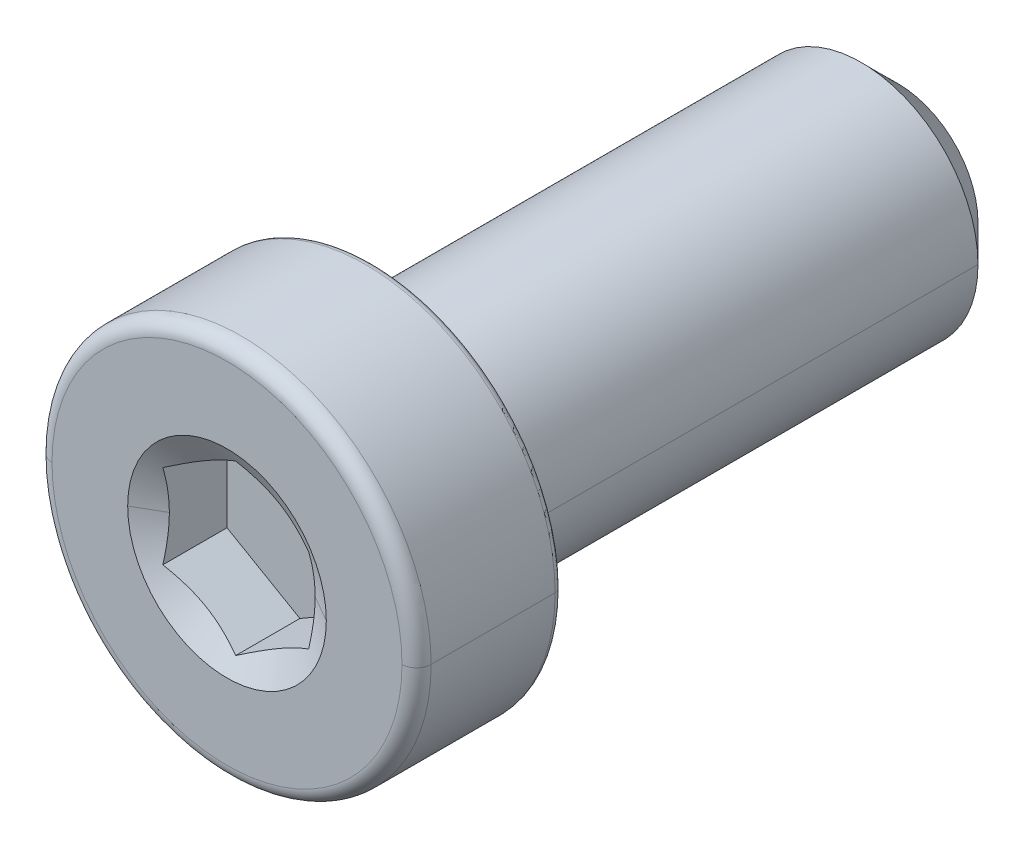
ISO-10303-21;
HEADER;
FILE_DESCRIPTION(('STEP AP214'),'2;1');
FILE_NAME('part.step','',(''),(''),'','','');
FILE_SCHEMA(('AUTOMOTIVE_DESIGN { 1 0 10303 214 1 1 1 1 }'));
ENDSEC;
DATA;
#1=APPLICATION_CONTEXT('core data for automotive mechanical design processes');
#2=APPLICATION_PROTOCOL_DEFINITION('international standard','automotive_design',2000,#1);
#3=PRODUCT_CONTEXT('',#1,'mechanical');
#4=PRODUCT('Part','Part','',(#3));
#5=PRODUCT_RELATED_PRODUCT_CATEGORY('part','',(#4));
#6=PRODUCT_DEFINITION_FORMATION('','',#4);
#7=PRODUCT_DEFINITION_CONTEXT('part definition',#1,'design');
#8=PRODUCT_DEFINITION('design','',#6,#7);
#9=PRODUCT_DEFINITION_SHAPE('','',#8);
#10=(LENGTH_UNIT() NAMED_UNIT(*) SI_UNIT(.MILLI.,.METRE.));
#11=(NAMED_UNIT(*) PLANE_ANGLE_UNIT() SI_UNIT($,.RADIAN.));
#12=(NAMED_UNIT(*) SI_UNIT($,.STERADIAN.) SOLID_ANGLE_UNIT());
#13=UNCERTAINTY_MEASURE_WITH_UNIT(LENGTH_MEASURE(1.E-05),#10,'distance_accuracy_value','');
#14=(GEOMETRIC_REPRESENTATION_CONTEXT(3) GLOBAL_UNCERTAINTY_ASSIGNED_CONTEXT((#13)) GLOBAL_UNIT_ASSIGNED_CONTEXT((#10,
#11,#12)) REPRESENTATION_CONTEXT('',''));
#15=CARTESIAN_POINT('',(0.,0.,0.));
#16=DIRECTION('',(0.,0.,1.));
#17=DIRECTION('',(1.,0.,0.));
#18=AXIS2_PLACEMENT_3D('',#15,#16,#17);
#19=CARTESIAN_POINT('',(0.,2.88675134594812,9.));
#20=DIRECTION('',(-0.5,0.866025403784439,0.));
#21=DIRECTION('',(0.,0.,1.));
#22=AXIS2_PLACEMENT_3D('',#19,#20,#21);
#23=PLANE('',#22);
#24=DIRECTION('',(0.,0.,1.));
#25=VECTOR('',#24,1.);
#26=CARTESIAN_POINT('',(0.,2.88675134594812,9.));
#27=LINE('',#26,#25);
#28=CARTESIAN_POINT('',(0.,2.88675134594812,9.));
#29=VERTEX_POINT('',#28);
#30=CARTESIAN_POINT('',(0.,2.88675134594812,11.2004275085881));
#31=VERTEX_POINT('',#30);
#32=EDGE_CURVE('E11',#29,#31,#27,.T.);
#33=ORIENTED_EDGE('',*,*,#32,.T.);
#34=CARTESIAN_POINT('',(0.,2.88675134594812,11.2004275085881));
#35=CARTESIAN_POINT('',(-0.668337161455183,2.50088670587255,10.9776484547674));
#36=CARTESIAN_POINT('',(-1.24761370688667,2.16644123643244,10.9771373916047));
#37=CARTESIAN_POINT('',(-1.55740642705021,1.98758232605303,10.9768640788863));
#38=CARTESIAN_POINT('',(-1.88103545904448,1.80073501731356,11.0371948002052));
#39=CARTESIAN_POINT('',(-2.17432824928568,1.63140234591643,11.0918702583488));
#40=CARTESIAN_POINT('',(-2.5,1.44337567297406,11.2004275085881));
#41=B_SPLINE_CURVE_WITH_KNOTS('',2,(#34,#35,#36,#37,#38,#39,#40),.UNSPECIFIED.,.F.,.F.,(3,2,2,
3),(0.,0.5,0.75,1.),.UNSPECIFIED.);
#42=CARTESIAN_POINT('',(-2.5,1.44337567297406,11.2004275085882));
#43=VERTEX_POINT('',#42);
#44=EDGE_CURVE('E180',#31,#43,#41,.T.);
#45=ORIENTED_EDGE('',*,*,#44,.T.);
#46=DIRECTION('',(0.,0.,1.));
#47=VECTOR('',#46,1.);
#48=CARTESIAN_POINT('',(-2.5,1.44337567297406,9.));
#49=LINE('',#48,#47);
#50=CARTESIAN_POINT('',(-2.5,1.44337567297406,9.));
#51=VERTEX_POINT('',#50);
#52=EDGE_CURVE('E174',#51,#43,#49,.T.);
#53=ORIENTED_EDGE('',*,*,#52,.F.);
#54=DIRECTION('',(-0.866025403784439,-0.5,0.));
#55=VECTOR('',#54,1.);
#56=CARTESIAN_POINT('',(0.,2.88675134594812,9.));
#57=LINE('',#56,#55);
#58=EDGE_CURVE('E419',#29,#51,#57,.T.);
#59=ORIENTED_EDGE('',*,*,#58,.F.);
#60=EDGE_LOOP('',(#33,#45,#53,#59));
#61=FACE_BOUND('',#60,.T.);
#62=ADVANCED_FACE('F16',(#61),#23,.F.);
#63=CARTESIAN_POINT('',(2.5,1.44337567297406,9.));
#64=DIRECTION('',(0.5,0.866025403784439,0.));
#65=DIRECTION('',(0.,0.,-1.));
#66=AXIS2_PLACEMENT_3D('',#63,#64,#65);
#67=PLANE('',#66);
#68=DIRECTION('',(0.,0.,1.));
#69=VECTOR('',#68,1.);
#70=CARTESIAN_POINT('',(2.5,1.44337567297406,9.));
#71=LINE('',#70,#69);
#72=CARTESIAN_POINT('',(2.5,1.44337567297406,9.));
#73=VERTEX_POINT('',#72);
#74=CARTESIAN_POINT('',(2.5,1.44337567297406,11.2004275085881));
#75=VERTEX_POINT('',#74);
#76=EDGE_CURVE('E28',#73,#75,#71,.T.);
#77=ORIENTED_EDGE('',*,*,#76,.T.);
#78=CARTESIAN_POINT('',(2.5,1.44337567297406,11.2004275085881));
#79=CARTESIAN_POINT('',(1.83166283853831,1.8292403130534,10.9776484547652));
#80=CARTESIAN_POINT('',(1.25238629311333,2.16368578248975,10.9771373916047));
#81=CARTESIAN_POINT('',(0.942593572943423,2.34254469287283,10.9768640788875));
#82=CARTESIAN_POINT('',(0.618964540955522,2.52939200160862,11.0371948002052));
#83=CARTESIAN_POINT('',(0.325671750714267,2.69872467300579,11.0918702583489));
#84=CARTESIAN_POINT('',(0.,2.88675134594812,11.2004275085881));
#85=B_SPLINE_CURVE_WITH_KNOTS('',2,(#78,#79,#80,#81,#82,#83,#84),.UNSPECIFIED.,.F.,.F.,(3,2,2,
3),(0.,0.5,0.75,1.),.UNSPECIFIED.);
#86=EDGE_CURVE('E406',#75,#31,#85,.T.);
#87=ORIENTED_EDGE('',*,*,#86,.T.);
#88=ORIENTED_EDGE('',*,*,#32,.F.);
#89=DIRECTION('',(-0.866025403784439,0.5,0.));
#90=VECTOR('',#89,1.);
#91=CARTESIAN_POINT('',(2.5,1.44337567297406,9.));
#92=LINE('',#91,#90);
#93=EDGE_CURVE('E272',#73,#29,#92,.T.);
#94=ORIENTED_EDGE('',*,*,#93,.F.);
#95=EDGE_LOOP('',(#77,#87,#88,#94));
#96=FACE_BOUND('',#95,.T.);
#97=ADVANCED_FACE('F312',(#96),#67,.F.);
#98=CARTESIAN_POINT('',(2.5,-1.44337567297406,9.));
#99=DIRECTION('',(1.,0.,0.));
#100=DIRECTION('',(0.,1.,0.));
#101=AXIS2_PLACEMENT_3D('',#98,#99,#100);
#102=PLANE('',#101);
#103=DIRECTION('',(0.,0.,1.));
#104=VECTOR('',#103,1.);
#105=CARTESIAN_POINT('',(2.5,-1.44337567297406,9.));
#106=LINE('',#105,#104);
#107=CARTESIAN_POINT('',(2.5,-1.44337567297406,9.));
#108=VERTEX_POINT('',#107);
#109=CARTESIAN_POINT('',(2.5,-1.44337567297406,11.2004275085881));
#110=VERTEX_POINT('',#109);
#111=EDGE_CURVE('E52',#108,#110,#106,.T.);
#112=ORIENTED_EDGE('',*,*,#111,.T.);
#113=CARTESIAN_POINT('',(2.5,-1.44337567297406,11.2004275085881));
#114=CARTESIAN_POINT('',(2.5,-1.06712601980721,11.0918135893189));
#115=CARTESIAN_POINT('',(2.5,-0.72721411045275,11.0369619110228));
#116=CARTESIAN_POINT('',(2.5,-0.356480429056918,10.9771365148955));
#117=CARTESIAN_POINT('',(2.5,0.,10.9771365148955));
#118=B_SPLINE_CURVE_WITH_KNOTS('',2,(#113,#114,#115,#116,#117),.UNSPECIFIED.,.F.,.F.,(3,2,3),
(0.,0.5,1.),.UNSPECIFIED.);
#119=CARTESIAN_POINT('',(2.5,0.,10.9771365148955));
#120=VERTEX_POINT('',#119);
#121=EDGE_CURVE('E329',#110,#120,#118,.T.);
#122=ORIENTED_EDGE('',*,*,#121,.T.);
#123=CARTESIAN_POINT('',(2.5,0.,10.9771365148955));
#124=CARTESIAN_POINT('',(2.5,0.358406770652268,10.9771365148955));
#125=CARTESIAN_POINT('',(2.5,0.732414374404408,11.0378032632905));
#126=CARTESIAN_POINT('',(2.5,1.06935846545522,11.0924580408669));
#127=CARTESIAN_POINT('',(2.5,1.44337567297406,11.2004275085881));
#128=B_SPLINE_CURVE_WITH_KNOTS('',2,(#123,#124,#125,#126,#127),.UNSPECIFIED.,.F.,.F.,(3,2,3),
(0.,0.5,1.),.UNSPECIFIED.);
#129=EDGE_CURVE('E298',#120,#75,#128,.T.);
#130=ORIENTED_EDGE('',*,*,#129,.T.);
#131=ORIENTED_EDGE('',*,*,#76,.F.);
#132=DIRECTION('',(0.,1.,0.));
#133=VECTOR('',#132,1.);
#134=CARTESIAN_POINT('',(2.5,-1.44337567297406,9.));
#135=LINE('',#134,#133);
#136=EDGE_CURVE('E281',#108,#73,#135,.T.);
#137=ORIENTED_EDGE('',*,*,#136,.F.);
#138=EDGE_LOOP('',(#112,#122,#130,#131,#137));
#139=FACE_BOUND('',#138,.T.);
#140=ADVANCED_FACE('F303',(#139),#102,.F.);
#141=CARTESIAN_POINT('',(0.,-2.88675134594812,9.));
#142=DIRECTION('',(0.5,-0.866025403784439,0.));
#143=DIRECTION('',(0.,0.,-1.));
#144=AXIS2_PLACEMENT_3D('',#141,#142,#143);
#145=PLANE('',#144);
#146=DIRECTION('',(0.,0.,1.));
#147=VECTOR('',#146,1.);
#148=CARTESIAN_POINT('',(0.,-2.88675134594812,9.));
#149=LINE('',#148,#147);
#150=CARTESIAN_POINT('',(0.,-2.88675134594812,9.));
#151=VERTEX_POINT('',#150);
#152=CARTESIAN_POINT('',(0.,-2.88675134594812,11.2004275085881));
#153=VERTEX_POINT('',#152);
#154=EDGE_CURVE('E278',#151,#153,#149,.T.);
#155=ORIENTED_EDGE('',*,*,#154,.T.);
#156=CARTESIAN_POINT('',(0.,-2.88675134594812,11.2004275085881));
#157=CARTESIAN_POINT('',(0.668337161451883,-2.50088670587445,10.9776484547685));
#158=CARTESIAN_POINT('',(1.24761370688667,-2.16644123643244,10.9771373916047));
#159=CARTESIAN_POINT('',(1.55740642704725,-1.98758232605474,10.9768640788857));
#160=CARTESIAN_POINT('',(1.88103545904447,-1.80073501731356,11.0371948002052));
#161=CARTESIAN_POINT('',(2.17432824928573,-1.6314023459164,11.0918702583489));
#162=CARTESIAN_POINT('',(2.49999999999999,-1.44337567297406,11.2004275085881));
#163=B_SPLINE_CURVE_WITH_KNOTS('',2,(#156,#157,#158,#159,#160,#161,#162),.UNSPECIFIED.,.F.,.F.,
(3,2,2,3),(0.,0.5,0.75,1.),.UNSPECIFIED.);
#164=EDGE_CURVE('E375',#153,#110,#163,.T.);
#165=ORIENTED_EDGE('',*,*,#164,.T.);
#166=ORIENTED_EDGE('',*,*,#111,.F.);
#167=DIRECTION('',(0.866025403784438,0.5,0.));
#168=VECTOR('',#167,1.);
#169=CARTESIAN_POINT('',(0.,-2.88675134594812,9.));
#170=LINE('',#169,#168);
#171=EDGE_CURVE('E291',#151,#108,#170,.T.);
#172=ORIENTED_EDGE('',*,*,#171,.F.);
#173=EDGE_LOOP('',(#155,#165,#166,#172));
#174=FACE_BOUND('',#173,.T.);
#175=ADVANCED_FACE('F311',(#174),#145,.F.);
#176=CARTESIAN_POINT('',(-2.5,-1.44337567297407,9.));
#177=DIRECTION('',(-0.5,-0.866025403784439,0.));
#178=DIRECTION('',(-0.866025403784439,0.5,0.));
#179=AXIS2_PLACEMENT_3D('',#176,#177,#178);
#180=PLANE('',#179);
#181=DIRECTION('',(0.,0.,1.));
#182=VECTOR('',#181,1.);
#183=CARTESIAN_POINT('',(-2.5,-1.44337567297407,9.));
#184=LINE('',#183,#182);
#185=CARTESIAN_POINT('',(-2.5,-1.44337567297407,9.));
#186=VERTEX_POINT('',#185);
#187=CARTESIAN_POINT('',(-2.5,-1.44337567297407,11.2004275085881));
#188=VERTEX_POINT('',#187);
#189=EDGE_CURVE('E271',#186,#188,#184,.T.);
#190=ORIENTED_EDGE('',*,*,#189,.T.);
#191=CARTESIAN_POINT('',(-2.5,-1.44337567297407,11.2004275085881));
#192=CARTESIAN_POINT('',(-1.83166283854483,-1.82924031304964,10.9776484547674));
#193=CARTESIAN_POINT('',(-1.25238629311333,-2.16368578248975,10.9771373916047));
#194=CARTESIAN_POINT('',(-0.942593572952958,-2.34254469286733,10.9768640788863));
#195=CARTESIAN_POINT('',(-0.618964540955527,-2.52939200160862,11.0371948002052));
#196=CARTESIAN_POINT('',(-0.325671750718056,-2.6987246730036,11.0918702583476));
#197=CARTESIAN_POINT('',(0.,-2.88675134594813,11.2004275085881));
#198=B_SPLINE_CURVE_WITH_KNOTS('',2,(#191,#192,#193,#194,#195,#196,#197),.UNSPECIFIED.,.F.,.F.,
(3,2,2,3),(0.,0.5,0.75,1.),.UNSPECIFIED.);
#199=EDGE_CURVE('E198',#188,#153,#198,.T.);
#200=ORIENTED_EDGE('',*,*,#199,.T.);
#201=ORIENTED_EDGE('',*,*,#154,.F.);
#202=DIRECTION('',(0.866025403784439,-0.5,0.));
#203=VECTOR('',#202,1.);
#204=CARTESIAN_POINT('',(-2.5,-1.44337567297407,9.));
#205=LINE('',#204,#203);
#206=EDGE_CURVE('E440',#186,#151,#205,.T.);
#207=ORIENTED_EDGE('',*,*,#206,.F.);
#208=EDGE_LOOP('',(#190,#200,#201,#207));
#209=FACE_BOUND('',#208,.T.);
#210=ADVANCED_FACE('F216',(#209),#180,.F.);
#211=CARTESIAN_POINT('',(-2.5,1.44337567297406,9.));
#212=DIRECTION('',(-1.,0.,0.));
#213=DIRECTION('',(0.,1.,0.));
#214=AXIS2_PLACEMENT_3D('',#211,#212,#213);
#215=PLANE('',#214);
#216=ORIENTED_EDGE('',*,*,#52,.T.);
#217=CARTESIAN_POINT('',(-2.5,1.44337567297406,11.2004275085881));
#218=CARTESIAN_POINT('',(-2.5,1.06995270684028,11.0926295835787));
#219=CARTESIAN_POINT('',(-2.5,0.732414374404409,11.0378032632905));
#220=CARTESIAN_POINT('',(-2.5,0.358919436573382,10.9771365148955));
#221=CARTESIAN_POINT('',(-2.5,0.,10.9771365148955));
#222=B_SPLINE_CURVE_WITH_KNOTS('',2,(#217,#218,#219,#220,#221),.UNSPECIFIED.,.F.,.F.,(3,2,3),
(0.,0.5,1.),.UNSPECIFIED.);
#223=CARTESIAN_POINT('',(-2.5,0.,10.9771365148955));
#224=VERTEX_POINT('',#223);
#225=EDGE_CURVE('E166',#43,#224,#222,.T.);
#226=ORIENTED_EDGE('',*,*,#225,.T.);
#227=CARTESIAN_POINT('',(-2.5,0.,10.9771365148955));
#228=CARTESIAN_POINT('',(-2.5,-0.355967710710843,10.9771365148955));
#229=CARTESIAN_POINT('',(-2.5,-0.727214110452753,11.0369619110228));
#230=CARTESIAN_POINT('',(-2.5,-1.0665319986419,11.0916421101791));
#231=CARTESIAN_POINT('',(-2.5,-1.44337567297407,11.2004275085881));
#232=B_SPLINE_CURVE_WITH_KNOTS('',2,(#227,#228,#229,#230,#231),.UNSPECIFIED.,.F.,.F.,(3,2,3),
(0.,0.5,1.),.UNSPECIFIED.);
#233=EDGE_CURVE('E171',#224,#188,#232,.T.);
#234=ORIENTED_EDGE('',*,*,#233,.T.);
#235=ORIENTED_EDGE('',*,*,#189,.F.);
#236=DIRECTION('',(0.,-1.,0.));
#237=VECTOR('',#236,1.);
#238=CARTESIAN_POINT('',(-2.5,1.44337567297406,9.));
#239=LINE('',#238,#237);
#240=EDGE_CURVE('E444',#51,#186,#239,.T.);
#241=ORIENTED_EDGE('',*,*,#240,.F.);
#242=EDGE_LOOP('',(#216,#226,#234,#235,#241));
#243=FACE_BOUND('',#242,.T.);
#244=ADVANCED_FACE('F169',(#243),#215,.F.);
#245=CARTESIAN_POINT('',(0.,0.,9.));
#246=DIRECTION('',(0.,0.,1.));
#247=DIRECTION('',(1.,0.,0.));
#248=AXIS2_PLACEMENT_3D('',#245,#246,#247);
#249=PLANE('',#248);
#250=ORIENTED_EDGE('',*,*,#58,.T.);
#251=ORIENTED_EDGE('',*,*,#240,.T.);
#252=ORIENTED_EDGE('',*,*,#206,.T.);
#253=ORIENTED_EDGE('',*,*,#171,.T.);
#254=ORIENTED_EDGE('',*,*,#136,.T.);
#255=ORIENTED_EDGE('',*,*,#93,.T.);
#256=EDGE_LOOP('',(#250,#251,#252,#253,#254,#255));
#257=FACE_BOUND('',#256,.T.);
#258=ADVANCED_FACE('F215',(#257),#249,.T.);
#259=CARTESIAN_POINT('',(0.,0.,11.5));
#260=DIRECTION('',(0.,0.,1.));
#261=DIRECTION('',(1.,0.,0.));
#262=AXIS2_PLACEMENT_3D('',#259,#260,#261);
#263=CONICAL_SURFACE('',#262,3.40562612162344,1.0471975511966);
#264=DIRECTION('',(-0.86602540378444,0.,0.5));
#265=VECTOR('',#264,1.);
#266=CARTESIAN_POINT('',(-3.40562612162344,0.,11.5));
#267=LINE('',#266,#265);
#268=CARTESIAN_POINT('',(-3.40562612162344,0.,11.5));
#269=VERTEX_POINT('',#268);
#270=EDGE_CURVE('E185',#224,#269,#267,.T.);
#271=ORIENTED_EDGE('',*,*,#270,.F.);
#272=ORIENTED_EDGE('',*,*,#225,.F.);
#273=ORIENTED_EDGE('',*,*,#44,.F.);
#274=ORIENTED_EDGE('',*,*,#86,.F.);
#275=ORIENTED_EDGE('',*,*,#129,.F.);
#276=DIRECTION('',(0.86602540378444,0.,0.5));
#277=VECTOR('',#276,1.);
#278=CARTESIAN_POINT('',(3.40562612162344,0.,11.5));
#279=LINE('',#278,#277);
#280=CARTESIAN_POINT('',(3.40562612162344,0.,11.5));
#281=VERTEX_POINT('',#280);
#282=EDGE_CURVE('E390',#120,#281,#279,.T.);
#283=ORIENTED_EDGE('',*,*,#282,.T.);
#284=CARTESIAN_POINT('',(0.,0.,11.5));
#285=DIRECTION('',(0.,0.,1.));
#286=DIRECTION('',(1.,0.,0.));
#287=AXIS2_PLACEMENT_3D('',#284,#285,#286);
#288=CIRCLE('',#287,3.40562612162344);
#289=EDGE_CURVE('E181',#281,#269,#288,.T.);
#290=ORIENTED_EDGE('',*,*,#289,.T.);
#291=EDGE_LOOP('',(#271,#272,#273,#274,#275,#283,#290));
#292=FACE_BOUND('',#291,.T.);
#293=ADVANCED_FACE('F186',(#292),#263,.F.);
#294=CARTESIAN_POINT('',(0.,6.,11.5));
#295=DIRECTION('',(0.,0.,1.));
#296=DIRECTION('',(1.,0.,0.));
#297=AXIS2_PLACEMENT_3D('',#294,#295,#296);
#298=PLANE('',#297);
#299=ORIENTED_EDGE('',*,*,#289,.F.);
#300=CARTESIAN_POINT('',(0.,0.,11.5));
#301=DIRECTION('',(0.,0.,1.));
#302=DIRECTION('',(1.,0.,0.));
#303=AXIS2_PLACEMENT_3D('',#300,#301,#302);
#304=CIRCLE('',#303,3.40562612162344);
#305=EDGE_CURVE('E192',#269,#281,#304,.T.);
#306=ORIENTED_EDGE('',*,*,#305,.F.);
#307=EDGE_LOOP('',(#299,#306));
#308=FACE_BOUND('',#307,.T.);
#309=CARTESIAN_POINT('',(0.,0.,11.5));
#310=DIRECTION('',(0.,0.,-1.));
#311=DIRECTION('',(-1.,0.,0.));
#312=AXIS2_PLACEMENT_3D('',#309,#310,#311);
#313=CIRCLE('',#312,6.);
#314=CARTESIAN_POINT('',(-6.,0.,11.5));
#315=VERTEX_POINT('',#314);
#316=CARTESIAN_POINT('',(6.,0.,11.5));
#317=VERTEX_POINT('',#316);
#318=EDGE_CURVE('E389',#315,#317,#313,.T.);
#319=ORIENTED_EDGE('',*,*,#318,.F.);
#320=CARTESIAN_POINT('',(0.,0.,11.5));
#321=DIRECTION('',(0.,0.,-1.));
#322=DIRECTION('',(-1.,0.,0.));
#323=AXIS2_PLACEMENT_3D('',#320,#321,#322);
#324=CIRCLE('',#323,6.);
#325=EDGE_CURVE('E454',#317,#315,#324,.T.);
#326=ORIENTED_EDGE('',*,*,#325,.F.);
#327=EDGE_LOOP('',(#319,#326));
#328=FACE_BOUND('',#327,.T.);
#329=ADVANCED_FACE('F217',(#308,#328),#298,.T.);
#330=CARTESIAN_POINT('',(0.,0.,11.));
#331=DIRECTION('',(0.,0.,-1.));
#332=DIRECTION('',(-1.,0.,0.));
#333=AXIS2_PLACEMENT_3D('',#330,#331,#332);
#334=TOROIDAL_SURFACE('',#333,6.,0.5);
#335=CARTESIAN_POINT('',(6.,0.,11.));
#336=DIRECTION('',(0.,1.,0.));
#337=DIRECTION('',(-1.,0.,0.));
#338=AXIS2_PLACEMENT_3D('',#335,#336,#337);
#339=CIRCLE('',#338,0.5);
#340=CARTESIAN_POINT('',(6.5,0.,11.));
#341=VERTEX_POINT('',#340);
#342=EDGE_CURVE('E522',#317,#341,#339,.T.);
#343=ORIENTED_EDGE('',*,*,#342,.F.);
#344=ORIENTED_EDGE('',*,*,#325,.T.);
#345=CARTESIAN_POINT('',(-6.,0.,11.));
#346=DIRECTION('',(0.,-1.,0.));
#347=DIRECTION('',(0.,0.,-1.));
#348=AXIS2_PLACEMENT_3D('',#345,#346,#347);
#349=CIRCLE('',#348,0.5);
#350=CARTESIAN_POINT('',(-6.5,0.,11.));
#351=VERTEX_POINT('',#350);
#352=EDGE_CURVE('E513',#315,#351,#349,.T.);
#353=ORIENTED_EDGE('',*,*,#352,.T.);
#354=CARTESIAN_POINT('',(0.,0.,11.));
#355=DIRECTION('',(0.,0.,-1.));
#356=DIRECTION('',(-1.,0.,0.));
#357=AXIS2_PLACEMENT_3D('',#354,#355,#356);
#358=CIRCLE('',#357,6.5);
#359=EDGE_CURVE('E457',#341,#351,#358,.T.);
#360=ORIENTED_EDGE('',*,*,#359,.F.);
#361=EDGE_LOOP('',(#343,#344,#353,#360));
#362=FACE_BOUND('',#361,.T.);
#363=ADVANCED_FACE('F245',(#362),#334,.T.);
#364=CARTESIAN_POINT('',(0.,0.,-11.5));
#365=DIRECTION('',(0.,0.,-1.));
#366=DIRECTION('',(-1.,0.,0.));
#367=AXIS2_PLACEMENT_3D('',#364,#365,#366);
#368=CYLINDRICAL_SURFACE('',#367,6.5);
#369=DIRECTION('',(0.,0.,-1.));
#370=VECTOR('',#369,1.);
#371=CARTESIAN_POINT('',(6.5,0.,-11.5));
#372=LINE('',#371,#370);
#373=CARTESIAN_POINT('',(6.5,0.,6.75));
#374=VERTEX_POINT('',#373);
#375=EDGE_CURVE('E509',#341,#374,#372,.T.);
#376=ORIENTED_EDGE('',*,*,#375,.F.);
#377=ORIENTED_EDGE('',*,*,#359,.T.);
#378=DIRECTION('',(0.,0.,-1.));
#379=VECTOR('',#378,1.);
#380=CARTESIAN_POINT('',(-6.5,0.,-11.5));
#381=LINE('',#380,#379);
#382=CARTESIAN_POINT('',(-6.5,0.,6.75));
#383=VERTEX_POINT('',#382);
#384=EDGE_CURVE('E518',#351,#383,#381,.T.);
#385=ORIENTED_EDGE('',*,*,#384,.T.);
#386=CARTESIAN_POINT('',(0.,0.,6.75));
#387=DIRECTION('',(0.,0.,-1.));
#388=DIRECTION('',(-1.,0.,0.));
#389=AXIS2_PLACEMENT_3D('',#386,#387,#388);
#390=CIRCLE('',#389,6.5);
#391=EDGE_CURVE('E460',#374,#383,#390,.T.);
#392=ORIENTED_EDGE('',*,*,#391,.F.);
#393=EDGE_LOOP('',(#376,#377,#385,#392));
#394=FACE_BOUND('',#393,.T.);
#395=ADVANCED_FACE('F558',(#394),#368,.T.);
#396=CARTESIAN_POINT('',(0.,0.,6.75));
#397=DIRECTION('',(0.,0.,-1.));
#398=DIRECTION('',(-1.,0.,0.));
#399=AXIS2_PLACEMENT_3D('',#396,#397,#398);
#400=TOROIDAL_SURFACE('',#399,6.25,0.25);
#401=CARTESIAN_POINT('',(6.25,0.,6.75));
#402=DIRECTION('',(0.,1.,0.));
#403=DIRECTION('',(-1.,0.,0.));
#404=AXIS2_PLACEMENT_3D('',#401,#402,#403);
#405=CIRCLE('',#404,0.25);
#406=CARTESIAN_POINT('',(6.25,0.,6.5));
#407=VERTEX_POINT('',#406);
#408=EDGE_CURVE('E508',#374,#407,#405,.T.);
#409=ORIENTED_EDGE('',*,*,#408,.F.);
#410=ORIENTED_EDGE('',*,*,#391,.T.);
#411=CARTESIAN_POINT('',(-6.25,0.,6.75));
#412=DIRECTION('',(0.,-1.,0.));
#413=DIRECTION('',(0.,0.,-1.));
#414=AXIS2_PLACEMENT_3D('',#411,#412,#413);
#415=CIRCLE('',#414,0.25);
#416=CARTESIAN_POINT('',(-6.25,0.,6.5));
#417=VERTEX_POINT('',#416);
#418=EDGE_CURVE('E501',#383,#417,#415,.T.);
#419=ORIENTED_EDGE('',*,*,#418,.T.);
#420=CARTESIAN_POINT('',(0.,0.,6.5));
#421=DIRECTION('',(0.,0.,-1.));
#422=DIRECTION('',(-1.,0.,0.));
#423=AXIS2_PLACEMENT_3D('',#420,#421,#422);
#424=CIRCLE('',#423,6.25);
#425=EDGE_CURVE('E463',#407,#417,#424,.T.);
#426=ORIENTED_EDGE('',*,*,#425,.F.);
#427=EDGE_LOOP('',(#409,#410,#419,#426));
#428=FACE_BOUND('',#427,.T.);
#429=ADVANCED_FACE('F543',(#428),#400,.T.);
#430=CARTESIAN_POINT('',(0.,4.,6.5));
#431=DIRECTION('',(0.,0.,-1.));
#432=DIRECTION('',(0.,-1.,0.));
#433=AXIS2_PLACEMENT_3D('',#430,#431,#432);
#434=PLANE('',#433);
#435=CARTESIAN_POINT('',(0.,0.,6.5));
#436=DIRECTION('',(0.,0.,-1.));
#437=DIRECTION('',(-1.,0.,0.));
#438=AXIS2_PLACEMENT_3D('',#435,#436,#437);
#439=CIRCLE('',#438,4.);
#440=CARTESIAN_POINT('',(-4.,0.,6.5));
#441=VERTEX_POINT('',#440);
#442=CARTESIAN_POINT('',(4.,0.,6.5));
#443=VERTEX_POINT('',#442);
#444=EDGE_CURVE('E497',#441,#443,#439,.T.);
#445=ORIENTED_EDGE('',*,*,#444,.F.);
#446=CARTESIAN_POINT('',(0.,0.,6.5));
#447=DIRECTION('',(0.,0.,-1.));
#448=DIRECTION('',(-1.,0.,0.));
#449=AXIS2_PLACEMENT_3D('',#446,#447,#448);
#450=CIRCLE('',#449,4.);
#451=EDGE_CURVE('E465',#443,#441,#450,.T.);
#452=ORIENTED_EDGE('',*,*,#451,.F.);
#453=EDGE_LOOP('',(#445,#452));
#454=FACE_BOUND('',#453,.T.);
#455=CARTESIAN_POINT('',(0.,0.,6.5));
#456=DIRECTION('',(0.,0.,-1.));
#457=DIRECTION('',(-1.,0.,0.));
#458=AXIS2_PLACEMENT_3D('',#455,#456,#457);
#459=CIRCLE('',#458,6.25);
#460=EDGE_CURVE('E505',#417,#407,#459,.T.);
#461=ORIENTED_EDGE('',*,*,#460,.T.);
#462=ORIENTED_EDGE('',*,*,#425,.T.);
#463=EDGE_LOOP('',(#461,#462));
#464=FACE_BOUND('',#463,.T.);
#465=ADVANCED_FACE('F545',(#454,#464),#434,.T.);
#466=CARTESIAN_POINT('',(0.,0.,-11.5));
#467=DIRECTION('',(0.,0.,-1.));
#468=DIRECTION('',(-1.,0.,0.));
#469=AXIS2_PLACEMENT_3D('',#466,#467,#468);
#470=CYLINDRICAL_SURFACE('',#469,4.);
#471=DIRECTION('',(0.,0.,-1.));
#472=VECTOR('',#471,1.);
#473=CARTESIAN_POINT('',(4.,0.,-11.5));
#474=LINE('',#473,#472);
#475=CARTESIAN_POINT('',(4.,0.,-10.25));
#476=VERTEX_POINT('',#475);
#477=EDGE_CURVE('E493',#443,#476,#474,.T.);
#478=ORIENTED_EDGE('',*,*,#477,.F.);
#479=ORIENTED_EDGE('',*,*,#451,.T.);
#480=DIRECTION('',(0.,0.,-1.));
#481=VECTOR('',#480,1.);
#482=CARTESIAN_POINT('',(-4.,0.,-11.5));
#483=LINE('',#482,#481);
#484=CARTESIAN_POINT('',(-4.,0.,-10.25));
#485=VERTEX_POINT('',#484);
#486=EDGE_CURVE('E485',#441,#485,#483,.T.);
#487=ORIENTED_EDGE('',*,*,#486,.T.);
#488=CARTESIAN_POINT('',(0.,0.,-10.25));
#489=DIRECTION('',(0.,0.,-1.));
#490=DIRECTION('',(-1.,0.,0.));
#491=AXIS2_PLACEMENT_3D('',#488,#489,#490);
#492=CIRCLE('',#491,4.);
#493=EDGE_CURVE('E467',#476,#485,#492,.T.);
#494=ORIENTED_EDGE('',*,*,#493,.F.);
#495=EDGE_LOOP('',(#478,#479,#487,#494));
#496=FACE_BOUND('',#495,.T.);
#497=ADVANCED_FACE('F547',(#496),#470,.T.);
#498=CARTESIAN_POINT('',(0.,0.,-11.5));
#499=DIRECTION('',(0.,0.,1.));
#500=DIRECTION('',(1.,0.,0.));
#501=AXIS2_PLACEMENT_3D('',#498,#499,#500);
#502=CONICAL_SURFACE('',#501,2.75,0.78539816339745);
#503=DIRECTION('',(-0.707106781186549,0.,0.707106781186546));
#504=VECTOR('',#503,1.);
#505=CARTESIAN_POINT('',(-2.75,0.,-11.5));
#506=LINE('',#505,#504);
#507=CARTESIAN_POINT('',(-2.75,0.,-11.5));
#508=VERTEX_POINT('',#507);
#509=EDGE_CURVE('E477',#508,#485,#506,.T.);
#510=ORIENTED_EDGE('',*,*,#509,.F.);
#511=CARTESIAN_POINT('',(0.,0.,-11.5));
#512=DIRECTION('',(0.,0.,-1.));
#513=DIRECTION('',(-1.,0.,0.));
#514=AXIS2_PLACEMENT_3D('',#511,#512,#513);
#515=CIRCLE('',#514,2.75);
#516=CARTESIAN_POINT('',(2.75,0.,-11.5));
#517=VERTEX_POINT('',#516);
#518=EDGE_CURVE('E470',#517,#508,#515,.T.);
#519=ORIENTED_EDGE('',*,*,#518,.F.);
#520=DIRECTION('',(0.707106781186549,0.,0.707106781186546));
#521=VECTOR('',#520,1.);
#522=CARTESIAN_POINT('',(2.75,0.,-11.5));
#523=LINE('',#522,#521);
#524=EDGE_CURVE('E473',#517,#476,#523,.T.);
#525=ORIENTED_EDGE('',*,*,#524,.T.);
#526=ORIENTED_EDGE('',*,*,#493,.T.);
#527=EDGE_LOOP('',(#510,#519,#525,#526));
#528=FACE_BOUND('',#527,.T.);
#529=ADVANCED_FACE('F555',(#528),#502,.T.);
#530=CARTESIAN_POINT('',(0.,0.,-11.5));
#531=DIRECTION('',(0.,0.,-1.));
#532=DIRECTION('',(0.,-1.,0.));
#533=AXIS2_PLACEMENT_3D('',#530,#531,#532);
#534=PLANE('',#533);
#535=ORIENTED_EDGE('',*,*,#518,.T.);
#536=CARTESIAN_POINT('',(0.,0.,-11.5));
#537=DIRECTION('',(0.,0.,-1.));
#538=DIRECTION('',(-1.,0.,0.));
#539=AXIS2_PLACEMENT_3D('',#536,#537,#538);
#540=CIRCLE('',#539,2.75);
#541=EDGE_CURVE('E481',#508,#517,#540,.T.);
#542=ORIENTED_EDGE('',*,*,#541,.T.);
#543=EDGE_LOOP('',(#535,#542));
#544=FACE_BOUND('',#543,.T.);
#545=ADVANCED_FACE('F646',(#544),#534,.T.);
#546=CARTESIAN_POINT('',(0.,0.,-11.5));
#547=DIRECTION('',(0.,0.,1.));
#548=DIRECTION('',(1.,0.,0.));
#549=AXIS2_PLACEMENT_3D('',#546,#547,#548);
#550=CONICAL_SURFACE('',#549,2.75,0.78539816339745);
#551=ORIENTED_EDGE('',*,*,#541,.F.);
#552=ORIENTED_EDGE('',*,*,#509,.T.);
#553=CARTESIAN_POINT('',(0.,0.,-10.25));
#554=DIRECTION('',(0.,0.,-1.));
#555=DIRECTION('',(-1.,0.,0.));
#556=AXIS2_PLACEMENT_3D('',#553,#554,#555);
#557=CIRCLE('',#556,4.);
#558=EDGE_CURVE('E489',#485,#476,#557,.T.);
#559=ORIENTED_EDGE('',*,*,#558,.T.);
#560=ORIENTED_EDGE('',*,*,#524,.F.);
#561=EDGE_LOOP('',(#551,#552,#559,#560));
#562=FACE_BOUND('',#561,.T.);
#563=ADVANCED_FACE('F657',(#562),#550,.T.);
#564=CARTESIAN_POINT('',(0.,0.,-11.5));
#565=DIRECTION('',(0.,0.,-1.));
#566=DIRECTION('',(-1.,0.,0.));
#567=AXIS2_PLACEMENT_3D('',#564,#565,#566);
#568=CYLINDRICAL_SURFACE('',#567,4.);
#569=ORIENTED_EDGE('',*,*,#444,.T.);
#570=ORIENTED_EDGE('',*,*,#477,.T.);
#571=ORIENTED_EDGE('',*,*,#558,.F.);
#572=ORIENTED_EDGE('',*,*,#486,.F.);
#573=EDGE_LOOP('',(#569,#570,#571,#572));
#574=FACE_BOUND('',#573,.T.);
#575=ADVANCED_FACE('F667',(#574),#568,.T.);
#576=CARTESIAN_POINT('',(0.,0.,6.75));
#577=DIRECTION('',(0.,0.,-1.));
#578=DIRECTION('',(-1.,0.,0.));
#579=AXIS2_PLACEMENT_3D('',#576,#577,#578);
#580=TOROIDAL_SURFACE('',#579,6.25,0.25);
#581=CARTESIAN_POINT('',(0.,0.,6.75));
#582=DIRECTION('',(0.,0.,-1.));
#583=DIRECTION('',(-1.,0.,0.));
#584=AXIS2_PLACEMENT_3D('',#581,#582,#583);
#585=CIRCLE('',#584,6.5);
#586=EDGE_CURVE('E512',#383,#374,#585,.T.);
#587=ORIENTED_EDGE('',*,*,#586,.T.);
#588=ORIENTED_EDGE('',*,*,#408,.T.);
#589=ORIENTED_EDGE('',*,*,#460,.F.);
#590=ORIENTED_EDGE('',*,*,#418,.F.);
#591=EDGE_LOOP('',(#587,#588,#589,#590));
#592=FACE_BOUND('',#591,.T.);
#593=ADVANCED_FACE('F243',(#592),#580,.T.);
#594=CARTESIAN_POINT('',(0.,0.,-11.5));
#595=DIRECTION('',(0.,0.,-1.));
#596=DIRECTION('',(-1.,0.,0.));
#597=AXIS2_PLACEMENT_3D('',#594,#595,#596);
#598=CYLINDRICAL_SURFACE('',#597,6.5);
#599=CARTESIAN_POINT('',(0.,0.,11.));
#600=DIRECTION('',(0.,0.,-1.));
#601=DIRECTION('',(-1.,0.,0.));
#602=AXIS2_PLACEMENT_3D('',#599,#600,#601);
#603=CIRCLE('',#602,6.5);
#604=EDGE_CURVE('E517',#351,#341,#603,.T.);
#605=ORIENTED_EDGE('',*,*,#604,.T.);
#606=ORIENTED_EDGE('',*,*,#375,.T.);
#607=ORIENTED_EDGE('',*,*,#586,.F.);
#608=ORIENTED_EDGE('',*,*,#384,.F.);
#609=EDGE_LOOP('',(#605,#606,#607,#608));
#610=FACE_BOUND('',#609,.T.);
#611=ADVANCED_FACE('F687',(#610),#598,.T.);
#612=CARTESIAN_POINT('',(0.,0.,11.));
#613=DIRECTION('',(0.,0.,-1.));
#614=DIRECTION('',(-1.,0.,0.));
#615=AXIS2_PLACEMENT_3D('',#612,#613,#614);
#616=TOROIDAL_SURFACE('',#615,6.,0.5);
#617=ORIENTED_EDGE('',*,*,#318,.T.);
#618=ORIENTED_EDGE('',*,*,#342,.T.);
#619=ORIENTED_EDGE('',*,*,#604,.F.);
#620=ORIENTED_EDGE('',*,*,#352,.F.);
#621=EDGE_LOOP('',(#617,#618,#619,#620));
#622=FACE_BOUND('',#621,.T.);
#623=ADVANCED_FACE('F340',(#622),#616,.T.);
#624=CARTESIAN_POINT('',(0.,0.,11.5));
#625=DIRECTION('',(0.,0.,1.));
#626=DIRECTION('',(1.,0.,0.));
#627=AXIS2_PLACEMENT_3D('',#624,#625,#626);
#628=CONICAL_SURFACE('',#627,3.40562612162344,1.0471975511966);
#629=ORIENTED_EDGE('',*,*,#233,.F.);
#630=ORIENTED_EDGE('',*,*,#270,.T.);
#631=ORIENTED_EDGE('',*,*,#305,.T.);
#632=ORIENTED_EDGE('',*,*,#282,.F.);
#633=ORIENTED_EDGE('',*,*,#121,.F.);
#634=ORIENTED_EDGE('',*,*,#164,.F.);
#635=ORIENTED_EDGE('',*,*,#199,.F.);
#636=EDGE_LOOP('',(#629,#630,#631,#632,#633,#634,#635));
#637=FACE_BOUND('',#636,.T.);
#638=ADVANCED_FACE('F195',(#637),#628,.F.);
#639=CLOSED_SHELL('',(#62,#97,#140,#175,#210,#244,#258,#293,#329,#363,#395,#429,#465,#497,#529,
#545,#563,#575,#593,#611,#623,#638));
#640=MANIFOLD_SOLID_BREP('B1',#639);
#641=ADVANCED_BREP_SHAPE_REPRESENTATION('',(#18,#640),#14);
#642=SHAPE_DEFINITION_REPRESENTATION(#9,#641);
ENDSEC;
END-ISO-10303-21;
